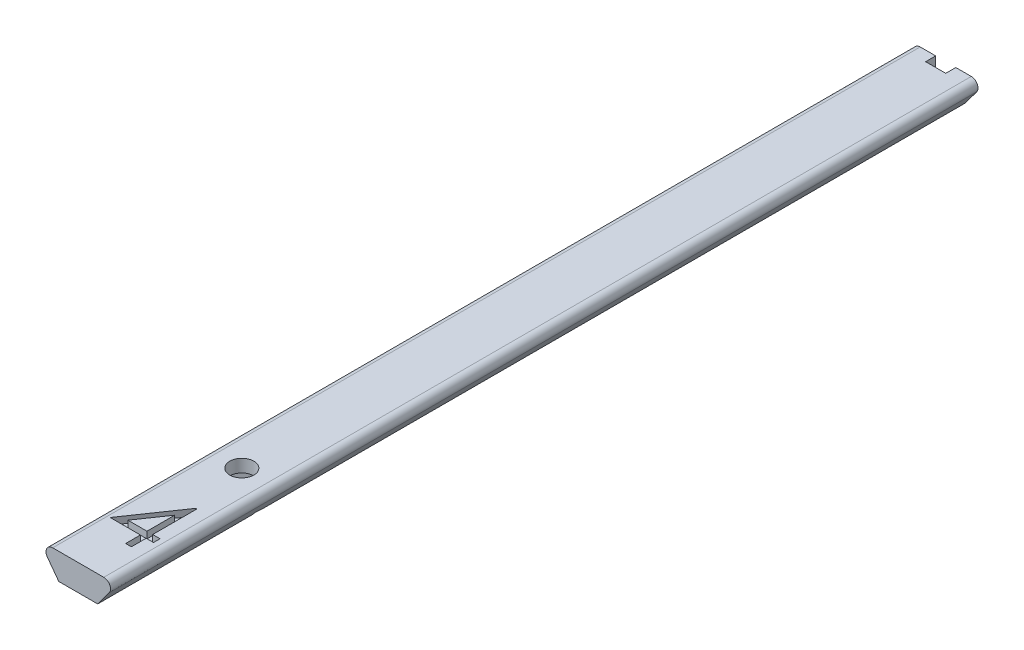
ISO-10303-21;
HEADER;
FILE_DESCRIPTION(('STEP AP214'),'2;1');
FILE_NAME('part.step','',(''),(''),'','','');
FILE_SCHEMA(('AUTOMOTIVE_DESIGN { 1 0 10303 214 1 1 1 1 }'));
ENDSEC;
DATA;
#1=APPLICATION_CONTEXT('core data for automotive mechanical design processes');
#2=APPLICATION_PROTOCOL_DEFINITION('international standard','automotive_design',2000,#1);
#3=PRODUCT_CONTEXT('',#1,'mechanical');
#4=PRODUCT('Part','Part','',(#3));
#5=PRODUCT_RELATED_PRODUCT_CATEGORY('part','',(#4));
#6=PRODUCT_DEFINITION_FORMATION('','',#4);
#7=PRODUCT_DEFINITION_CONTEXT('part definition',#1,'design');
#8=PRODUCT_DEFINITION('design','',#6,#7);
#9=PRODUCT_DEFINITION_SHAPE('','',#8);
#10=(LENGTH_UNIT() NAMED_UNIT(*) SI_UNIT(.MILLI.,.METRE.));
#11=(NAMED_UNIT(*) PLANE_ANGLE_UNIT() SI_UNIT($,.RADIAN.));
#12=(NAMED_UNIT(*) SI_UNIT($,.STERADIAN.) SOLID_ANGLE_UNIT());
#13=UNCERTAINTY_MEASURE_WITH_UNIT(LENGTH_MEASURE(1.E-05),#10,'distance_accuracy_value','');
#14=(GEOMETRIC_REPRESENTATION_CONTEXT(3) GLOBAL_UNCERTAINTY_ASSIGNED_CONTEXT((#13)) GLOBAL_UNIT_ASSIGNED_CONTEXT((#10,
#11,#12)) REPRESENTATION_CONTEXT('',''));
#15=CARTESIAN_POINT('',(0.,0.,0.));
#16=DIRECTION('',(0.,0.,1.));
#17=DIRECTION('',(1.,0.,0.));
#18=AXIS2_PLACEMENT_3D('',#15,#16,#17);
#19=CARTESIAN_POINT('',(-2.9,3.9,171.2));
#20=DIRECTION('',(0.,-1.,0.));
#21=DIRECTION('',(0.,0.,-1.));
#22=AXIS2_PLACEMENT_3D('',#19,#20,#21);
#23=PLANE('',#22);
#24=DIRECTION('',(1.,0.,0.));
#25=VECTOR('',#24,1.);
#26=CARTESIAN_POINT('',(-12.9151598258059,3.9,41.8));
#27=LINE('',#26,#25);
#28=CARTESIAN_POINT('',(4.4,3.9,41.8));
#29=VERTEX_POINT('',#28);
#30=CARTESIAN_POINT('',(6.71024585843868,3.9,41.8));
#31=VERTEX_POINT('',#30);
#32=EDGE_CURVE('E57',#29,#31,#27,.T.);
#33=ORIENTED_EDGE('',*,*,#32,.F.);
#34=DIRECTION('',(0.,0.,-1.));
#35=VECTOR('',#34,1.);
#36=CARTESIAN_POINT('',(4.4,3.9,43.3));
#37=LINE('',#36,#35);
#38=CARTESIAN_POINT('',(4.4,3.9,43.3));
#39=VERTEX_POINT('',#38);
#40=EDGE_CURVE('E261',#39,#29,#37,.T.);
#41=ORIENTED_EDGE('',*,*,#40,.F.);
#42=DIRECTION('',(1.,0.,0.));
#43=VECTOR('',#42,1.);
#44=CARTESIAN_POINT('',(1.4,3.9,43.3));
#45=LINE('',#44,#43);
#46=CARTESIAN_POINT('',(1.4,3.9,43.3));
#47=VERTEX_POINT('',#46);
#48=EDGE_CURVE('E264',#47,#39,#45,.T.);
#49=ORIENTED_EDGE('',*,*,#48,.F.);
#50=DIRECTION('',(0.,0.,1.));
#51=VECTOR('',#50,1.);
#52=CARTESIAN_POINT('',(1.4,3.9,43.3));
#53=LINE('',#52,#51);
#54=CARTESIAN_POINT('',(1.4,3.9,41.8));
#55=VERTEX_POINT('',#54);
#56=EDGE_CURVE('E251',#55,#47,#53,.T.);
#57=ORIENTED_EDGE('',*,*,#56,.F.);
#58=CARTESIAN_POINT('',(-0.91024585843868,3.9,41.8));
#59=VERTEX_POINT('',#58);
#60=EDGE_CURVE('E267',#59,#55,#27,.T.);
#61=ORIENTED_EDGE('',*,*,#60,.F.);
#62=DIRECTION('',(0.,0.,-1.));
#63=VECTOR('',#62,1.);
#64=CARTESIAN_POINT('',(-0.91024585843868,3.9,171.2));
#65=LINE('',#64,#63);
#66=CARTESIAN_POINT('',(-0.91024585843868,3.9,171.2));
#67=VERTEX_POINT('',#66);
#68=EDGE_CURVE('E459',#59,#67,#65,.F.);
#69=ORIENTED_EDGE('',*,*,#68,.T.);
#70=DIRECTION('',(-1.,0.,0.));
#71=VECTOR('',#70,1.);
#72=CARTESIAN_POINT('',(-2.9,3.9,171.2));
#73=LINE('',#72,#71);
#74=CARTESIAN_POINT('',(6.71024585843868,3.9,171.2));
#75=VERTEX_POINT('',#74);
#76=EDGE_CURVE('E442',#75,#67,#73,.T.);
#77=ORIENTED_EDGE('',*,*,#76,.F.);
#78=DIRECTION('',(0.,0.,-1.));
#79=VECTOR('',#78,1.);
#80=CARTESIAN_POINT('',(6.71024585843868,3.9,171.2));
#81=LINE('',#80,#79);
#82=EDGE_CURVE('E456',#75,#31,#81,.T.);
#83=ORIENTED_EDGE('',*,*,#82,.T.);
#84=EDGE_LOOP('',(#33,#41,#49,#57,#61,#69,#77,#83));
#85=FACE_BOUND('',#84,.T.);
#86=CARTESIAN_POINT('',(2.9,3.89999999999999,146.8));
#87=DIRECTION('',(0.,-1.,0.));
#88=DIRECTION('',(0.,0.,-1.));
#89=AXIS2_PLACEMENT_3D('',#86,#87,#88);
#90=CIRCLE('',#89,1.8);
#91=CARTESIAN_POINT('',(2.9,3.89999999999999,145.));
#92=VERTEX_POINT('',#91);
#93=EDGE_CURVE('E434',#92,#92,#90,.T.);
#94=ORIENTED_EDGE('',*,*,#93,.T.);
#95=EDGE_LOOP('',(#94));
#96=FACE_BOUND('',#95,.T.);
#97=DIRECTION('',(0.566105543193207,0.,-0.824332768950698));
#98=VECTOR('',#97,1.);
#99=CARTESIAN_POINT('',(-0.543899704592526,3.9,163.001923076923));
#100=LINE('',#99,#98);
#101=CARTESIAN_POINT('',(-0.543899704592526,3.9,163.001923076923));
#102=VERTEX_POINT('',#101);
#103=CARTESIAN_POINT('',(4.6555444059844,3.9,155.430769230769));
#104=VERTEX_POINT('',#103);
#105=EDGE_CURVE('E302',#102,#104,#100,.T.);
#106=ORIENTED_EDGE('',*,*,#105,.T.);
#107=DIRECTION('',(1.,0.,0.));
#108=VECTOR('',#107,1.);
#109=CARTESIAN_POINT('',(4.6555444059844,3.9,155.430769230769));
#110=LINE('',#109,#108);
#111=CARTESIAN_POINT('',(4.8291772184844,3.9,155.430769230769));
#112=VERTEX_POINT('',#111);
#113=EDGE_CURVE('E332',#104,#112,#110,.T.);
#114=ORIENTED_EDGE('',*,*,#113,.T.);
#115=DIRECTION('',(0.,0.,1.));
#116=VECTOR('',#115,1.);
#117=CARTESIAN_POINT('',(4.8291772184844,3.9,155.430769230769));
#118=LINE('',#117,#116);
#119=CARTESIAN_POINT('',(4.8291772184844,3.9,162.025));
#120=VERTEX_POINT('',#119);
#121=EDGE_CURVE('E335',#112,#120,#118,.T.);
#122=ORIENTED_EDGE('',*,*,#121,.T.);
#123=DIRECTION('',(1.,0.,0.));
#124=VECTOR('',#123,1.);
#125=CARTESIAN_POINT('',(4.8291772184844,3.9,162.025));
#126=LINE('',#125,#124);
#127=CARTESIAN_POINT('',(5.92821568002286,3.9,162.025));
#128=VERTEX_POINT('',#127);
#129=EDGE_CURVE('E338',#120,#128,#126,.T.);
#130=ORIENTED_EDGE('',*,*,#129,.T.);
#131=DIRECTION('',(0.,0.,1.));
#132=VECTOR('',#131,1.);
#133=CARTESIAN_POINT('',(5.92821568002286,3.9,162.025));
#134=LINE('',#133,#132);
#135=CARTESIAN_POINT('',(5.92821568002286,3.9,163.001923076923));
#136=VERTEX_POINT('',#135);
#137=EDGE_CURVE('E341',#128,#136,#134,.T.);
#138=ORIENTED_EDGE('',*,*,#137,.T.);
#139=DIRECTION('',(-1.,0.,0.));
#140=VECTOR('',#139,1.);
#141=CARTESIAN_POINT('',(5.92821568002286,3.9,163.001923076923));
#142=LINE('',#141,#140);
#143=CARTESIAN_POINT('',(4.8291772184844,3.9,163.001923076923));
#144=VERTEX_POINT('',#143);
#145=EDGE_CURVE('E344',#136,#144,#142,.T.);
#146=ORIENTED_EDGE('',*,*,#145,.T.);
#147=DIRECTION('',(0.,0.,1.));
#148=VECTOR('',#147,1.);
#149=CARTESIAN_POINT('',(4.8291772184844,3.9,163.001923076923));
#150=LINE('',#149,#148);
#151=CARTESIAN_POINT('',(4.8291772184844,3.9,165.2));
#152=VERTEX_POINT('',#151);
#153=EDGE_CURVE('E347',#144,#152,#150,.T.);
#154=ORIENTED_EDGE('',*,*,#153,.T.);
#155=DIRECTION('',(-1.,0.,0.));
#156=VECTOR('',#155,1.);
#157=CARTESIAN_POINT('',(4.8291772184844,3.9,165.2));
#158=LINE('',#157,#156);
#159=CARTESIAN_POINT('',(3.9743695261767,3.9,165.2));
#160=VERTEX_POINT('',#159);
#161=EDGE_CURVE('E350',#152,#160,#158,.T.);
#162=ORIENTED_EDGE('',*,*,#161,.T.);
#163=DIRECTION('',(0.,0.,-1.));
#164=VECTOR('',#163,1.);
#165=CARTESIAN_POINT('',(3.9743695261767,3.9,165.2));
#166=LINE('',#165,#164);
#167=CARTESIAN_POINT('',(3.9743695261767,3.9,163.001923076923));
#168=VERTEX_POINT('',#167);
#169=EDGE_CURVE('E353',#160,#168,#166,.T.);
#170=ORIENTED_EDGE('',*,*,#169,.T.);
#171=DIRECTION('',(-1.,0.,0.));
#172=VECTOR('',#171,1.);
#173=CARTESIAN_POINT('',(3.9743695261767,3.9,163.001923076923));
#174=LINE('',#173,#172);
#175=EDGE_CURVE('E311',#168,#102,#174,.T.);
#176=ORIENTED_EDGE('',*,*,#175,.T.);
#177=EDGE_LOOP('',(#106,#114,#122,#130,#138,#146,#154,#162,#170,#176));
#178=FACE_BOUND('',#177,.T.);
#179=ADVANCED_FACE('F35',(#85,#96,#178),#23,.F.);
#180=CARTESIAN_POINT('',(0.,0.,171.2));
#181=DIRECTION('',(0.,1.,0.));
#182=DIRECTION('',(0.,0.,1.));
#183=AXIS2_PLACEMENT_3D('',#180,#181,#182);
#184=PLANE('',#183);
#185=DIRECTION('',(0.,0.,-1.));
#186=VECTOR('',#185,1.);
#187=CARTESIAN_POINT('',(0.,0.,171.2));
#188=LINE('',#187,#186);
#189=CARTESIAN_POINT('',(0.,0.,145.476986060241));
#190=VERTEX_POINT('',#189);
#191=CARTESIAN_POINT('',(0.,0.,41.8));
#192=VERTEX_POINT('',#191);
#193=EDGE_CURVE('E449',#190,#192,#188,.T.);
#194=ORIENTED_EDGE('',*,*,#193,.T.);
#195=DIRECTION('',(1.,0.,0.));
#196=VECTOR('',#195,1.);
#197=CARTESIAN_POINT('',(0.,0.,41.8));
#198=LINE('',#197,#196);
#199=CARTESIAN_POINT('',(5.8,0.,41.8));
#200=VERTEX_POINT('',#199);
#201=EDGE_CURVE('E273',#192,#200,#198,.T.);
#202=ORIENTED_EDGE('',*,*,#201,.T.);
#203=DIRECTION('',(0.,0.,-1.));
#204=VECTOR('',#203,1.);
#205=CARTESIAN_POINT('',(5.8,0.,171.2));
#206=LINE('',#205,#204);
#207=CARTESIAN_POINT('',(5.8,0.,146.521938005987));
#208=VERTEX_POINT('',#207);
#209=EDGE_CURVE('E445',#208,#200,#206,.T.);
#210=ORIENTED_EDGE('',*,*,#209,.F.);
#211=DIRECTION('',(0.190019918599868,0.,0.981780235355805));
#212=VECTOR('',#211,1.);
#213=CARTESIAN_POINT('',(5.42900933418225,0.,144.605132094874));
#214=LINE('',#213,#212);
#215=CARTESIAN_POINT('',(5.42900933418225,0.,144.605132094874));
#216=VERTEX_POINT('',#215);
#217=EDGE_CURVE('E384',#216,#208,#214,.T.);
#218=ORIENTED_EDGE('',*,*,#217,.F.);
#219=DIRECTION('',(0.94525658405152,0.,0.326328040945384));
#220=VECTOR('',#219,1.);
#221=CARTESIAN_POINT('',(2.26369330330089,0.,143.512379717627));
#222=LINE('',#221,#220);
#223=CARTESIAN_POINT('',(2.26369330330089,0.,143.512379717627));
#224=VERTEX_POINT('',#223);
#225=EDGE_CURVE('E408',#224,#216,#222,.T.);
#226=ORIENTED_EDGE('',*,*,#225,.F.);
#227=DIRECTION('',(0.755236665451656,0.,-0.655452194410442));
#228=VECTOR('',#227,1.);
#229=CARTESIAN_POINT('',(-0.265316030881379,0.,145.707247622753));
#230=LINE('',#229,#228);
#231=EDGE_CURVE('E406',#190,#224,#230,.T.);
#232=ORIENTED_EDGE('',*,*,#231,.F.);
#233=EDGE_LOOP('',(#194,#202,#210,#218,#226,#232));
#234=FACE_BOUND('',#233,.T.);
#235=ADVANCED_FACE('F497',(#234),#184,.F.);
#236=CARTESIAN_POINT('',(2.9,200.,146.8));
#237=DIRECTION('',(0.,-1.,0.));
#238=DIRECTION('',(0.,0.,-1.));
#239=AXIS2_PLACEMENT_3D('',#236,#237,#238);
#240=CYLINDRICAL_SURFACE('',#239,1.8);
#241=ORIENTED_EDGE('',*,*,#93,.F.);
#242=EDGE_LOOP('',(#241));
#243=FACE_BOUND('',#242,.T.);
#244=CARTESIAN_POINT('',(2.9,2.,146.8));
#245=DIRECTION('',(0.,-1.,0.));
#246=DIRECTION('',(0.,0.,-1.));
#247=AXIS2_PLACEMENT_3D('',#244,#245,#246);
#248=CIRCLE('',#247,1.8);
#249=CARTESIAN_POINT('',(2.9,2.,145.));
#250=VERTEX_POINT('',#249);
#251=EDGE_CURVE('E415',#250,#250,#248,.F.);
#252=ORIENTED_EDGE('',*,*,#251,.F.);
#253=EDGE_LOOP('',(#252));
#254=FACE_BOUND('',#253,.T.);
#255=ADVANCED_FACE('F502',(#243,#254),#240,.F.);
#256=CARTESIAN_POINT('',(0.,0.,171.2));
#257=DIRECTION('',(0.802462340946133,0.596702766344561,0.));
#258=DIRECTION('',(-0.596702766344561,0.802462340946133,0.));
#259=AXIS2_PLACEMENT_3D('',#256,#257,#258);
#260=PLANE('',#259);
#261=DIRECTION('',(0.,0.,-1.));
#262=VECTOR('',#261,1.);
#263=CARTESIAN_POINT('',(-1.71270819938481,2.30329723365544,171.2));
#264=LINE('',#263,#262);
#265=CARTESIAN_POINT('',(-1.71270819938481,2.30329723365544,171.2));
#266=VERTEX_POINT('',#265);
#267=CARTESIAN_POINT('',(-1.71270819938481,2.30329723365544,41.8));
#268=VERTEX_POINT('',#267);
#269=EDGE_CURVE('E453',#266,#268,#264,.T.);
#270=ORIENTED_EDGE('',*,*,#269,.T.);
#271=DIRECTION('',(0.596702766344561,-0.802462340946133,0.));
#272=VECTOR('',#271,1.);
#273=CARTESIAN_POINT('',(0.,0.,41.8));
#274=LINE('',#273,#272);
#275=EDGE_CURVE('E276',#268,#192,#274,.T.);
#276=ORIENTED_EDGE('',*,*,#275,.T.);
#277=ORIENTED_EDGE('',*,*,#193,.F.);
#278=DIRECTION('',(-0.529867163168724,0.71257997805449,0.459859287468885));
#279=VECTOR('',#278,1.);
#280=CARTESIAN_POINT('',(-6.2677811143264,8.42908494685274,150.916646332843));
#281=LINE('',#280,#279);
#282=CARTESIAN_POINT('',(-0.265316030881378,0.356804317392195,145.707247622753));
#283=VERTEX_POINT('',#282);
#284=EDGE_CURVE('E431',#190,#283,#281,.T.);
#285=ORIENTED_EDGE('',*,*,#284,.T.);
#286=DIRECTION('',(0.184103736790054,-0.247587783959038,0.951212964237868));
#287=VECTOR('',#286,1.);
#288=CARTESIAN_POINT('',(4.22427867934336,-5.68092649980659,168.903738726079));
#289=LINE('',#288,#287);
#290=CARTESIAN_POINT('',(0.,0.,147.078061994013));
#291=VERTEX_POINT('',#290);
#292=EDGE_CURVE('E428',#283,#291,#289,.T.);
#293=ORIENTED_EDGE('',*,*,#292,.T.);
#294=CARTESIAN_POINT('',(0.,0.,171.2));
#295=VERTEX_POINT('',#294);
#296=EDGE_CURVE('E450',#295,#291,#188,.T.);
#297=ORIENTED_EDGE('',*,*,#296,.F.);
#298=DIRECTION('',(0.596702766344561,-0.802462340946133,0.));
#299=VECTOR('',#298,1.);
#300=CARTESIAN_POINT('',(0.,0.,171.2));
#301=LINE('',#300,#299);
#302=EDGE_CURVE('E435',#266,#295,#301,.T.);
#303=ORIENTED_EDGE('',*,*,#302,.F.);
#304=EDGE_LOOP('',(#270,#276,#277,#285,#293,#297,#303));
#305=FACE_BOUND('',#304,.T.);
#306=ADVANCED_FACE('F619',(#305),#260,.F.);
#307=DIRECTION('',(-0.94525658405153,0.,-0.326328040945354));
#308=VECTOR('',#307,1.);
#309=CARTESIAN_POINT('',(3.53630669669914,0.,150.087620282373));
#310=LINE('',#309,#308);
#311=CARTESIAN_POINT('',(3.53630669669914,0.,150.087620282373));
#312=VERTEX_POINT('',#311);
#313=CARTESIAN_POINT('',(0.370990665817778,0.,148.994867905126));
#314=VERTEX_POINT('',#313);
#315=EDGE_CURVE('E401',#312,#314,#310,.T.);
#316=ORIENTED_EDGE('',*,*,#315,.F.);
#317=DIRECTION('',(-0.755236665451676,0.,0.655452194410419));
#318=VECTOR('',#317,1.);
#319=CARTESIAN_POINT('',(6.0653160308814,0.,147.892752377247));
#320=LINE('',#319,#318);
#321=CARTESIAN_POINT('',(5.8,0.,148.123013939759));
#322=VERTEX_POINT('',#321);
#323=EDGE_CURVE('E379',#322,#312,#320,.T.);
#324=ORIENTED_EDGE('',*,*,#323,.F.);
#325=CARTESIAN_POINT('',(5.8,0.,171.2));
#326=VERTEX_POINT('',#325);
#327=EDGE_CURVE('E446',#326,#322,#206,.T.);
#328=ORIENTED_EDGE('',*,*,#327,.F.);
#329=DIRECTION('',(1.,0.,0.));
#330=VECTOR('',#329,1.);
#331=CARTESIAN_POINT('',(0.,0.,171.2));
#332=LINE('',#331,#330);
#333=EDGE_CURVE('E437',#295,#326,#332,.T.);
#334=ORIENTED_EDGE('',*,*,#333,.F.);
#335=ORIENTED_EDGE('',*,*,#296,.T.);
#336=DIRECTION('',(-0.190019918599871,0.,-0.981780235355804));
#337=VECTOR('',#336,1.);
#338=CARTESIAN_POINT('',(0.370990665817778,0.,148.994867905126));
#339=LINE('',#338,#337);
#340=EDGE_CURVE('E404',#314,#291,#339,.T.);
#341=ORIENTED_EDGE('',*,*,#340,.F.);
#342=EDGE_LOOP('',(#316,#324,#328,#334,#335,#341));
#343=FACE_BOUND('',#342,.T.);
#344=ADVANCED_FACE('F505',(#343),#184,.F.);
#345=CARTESIAN_POINT('',(5.8,0.,171.2));
#346=DIRECTION('',(-0.802462340946134,0.596702766344561,0.));
#347=DIRECTION('',(-0.596702766344561,-0.802462340946134,0.));
#348=AXIS2_PLACEMENT_3D('',#345,#346,#347);
#349=PLANE('',#348);
#350=ORIENTED_EDGE('',*,*,#209,.T.);
#351=DIRECTION('',(0.596702766344561,0.802462340946134,0.));
#352=VECTOR('',#351,1.);
#353=CARTESIAN_POINT('',(5.8,0.,41.8));
#354=LINE('',#353,#352);
#355=CARTESIAN_POINT('',(7.51270819938481,2.30329723365544,41.8));
#356=VERTEX_POINT('',#355);
#357=EDGE_CURVE('E270',#200,#356,#354,.T.);
#358=ORIENTED_EDGE('',*,*,#357,.T.);
#359=DIRECTION('',(0.,0.,-1.));
#360=VECTOR('',#359,1.);
#361=CARTESIAN_POINT('',(7.51270819938481,2.30329723365544,171.2));
#362=LINE('',#361,#360);
#363=CARTESIAN_POINT('',(7.51270819938481,2.30329723365544,171.2));
#364=VERTEX_POINT('',#363);
#365=EDGE_CURVE('E465',#356,#364,#362,.F.);
#366=ORIENTED_EDGE('',*,*,#365,.T.);
#367=DIRECTION('',(0.596702766344561,0.802462340946133,0.));
#368=VECTOR('',#367,1.);
#369=CARTESIAN_POINT('',(5.8,0.,171.2));
#370=LINE('',#369,#368);
#371=EDGE_CURVE('E439',#326,#364,#370,.T.);
#372=ORIENTED_EDGE('',*,*,#371,.F.);
#373=ORIENTED_EDGE('',*,*,#327,.T.);
#374=DIRECTION('',(0.529867163168731,0.7125799780545,-0.459859287468863));
#375=VECTOR('',#374,1.);
#376=CARTESIAN_POINT('',(0.176961512259686,-7.56201727661629,153.003117203601));
#377=LINE('',#376,#375);
#378=CARTESIAN_POINT('',(6.0653160308814,0.35680431739223,147.892752377247));
#379=VERTEX_POINT('',#378);
#380=EDGE_CURVE('E474',#322,#379,#377,.T.);
#381=ORIENTED_EDGE('',*,*,#380,.T.);
#382=DIRECTION('',(-0.184103736790051,-0.247587783959034,-0.95121296423787));
#383=VECTOR('',#382,1.);
#384=CARTESIAN_POINT('',(10.1216681471841,5.81189854276489,168.85079911663));
#385=LINE('',#384,#383);
#386=EDGE_CURVE('E467',#379,#208,#385,.T.);
#387=ORIENTED_EDGE('',*,*,#386,.T.);
#388=EDGE_LOOP('',(#350,#358,#366,#372,#373,#381,#387));
#389=FACE_BOUND('',#388,.T.);
#390=ADVANCED_FACE('F624',(#389),#349,.F.);
#391=CARTESIAN_POINT('',(0.,0.,171.2));
#392=DIRECTION('',(0.,0.,-1.));
#393=DIRECTION('',(-1.,0.,0.));
#394=AXIS2_PLACEMENT_3D('',#391,#392,#393);
#395=PLANE('',#394);
#396=ORIENTED_EDGE('',*,*,#76,.T.);
#397=CARTESIAN_POINT('',(-0.91024585843868,2.9,171.2));
#398=DIRECTION('',(0.,0.,-1.));
#399=DIRECTION('',(-1.,0.,0.));
#400=AXIS2_PLACEMENT_3D('',#397,#398,#399);
#401=CIRCLE('',#400,1.);
#402=EDGE_CURVE('E463',#67,#266,#401,.F.);
#403=ORIENTED_EDGE('',*,*,#402,.T.);
#404=ORIENTED_EDGE('',*,*,#302,.T.);
#405=ORIENTED_EDGE('',*,*,#333,.T.);
#406=ORIENTED_EDGE('',*,*,#371,.T.);
#407=CARTESIAN_POINT('',(6.71024585843868,2.9,171.2));
#408=DIRECTION('',(0.,0.,-1.));
#409=DIRECTION('',(-1.,0.,0.));
#410=AXIS2_PLACEMENT_3D('',#407,#408,#409);
#411=CIRCLE('',#410,1.);
#412=EDGE_CURVE('E461',#364,#75,#411,.F.);
#413=ORIENTED_EDGE('',*,*,#412,.T.);
#414=EDGE_LOOP('',(#396,#403,#404,#405,#406,#413));
#415=FACE_BOUND('',#414,.T.);
#416=ADVANCED_FACE('F621',(#415),#395,.F.);
#417=CARTESIAN_POINT('',(-0.91024585843868,2.9,171.2));
#418=DIRECTION('',(0.,0.,-1.));
#419=DIRECTION('',(-1.,0.,0.));
#420=AXIS2_PLACEMENT_3D('',#417,#418,#419);
#421=CYLINDRICAL_SURFACE('',#420,1.);
#422=CARTESIAN_POINT('',(-0.91024585843868,2.9,41.8));
#423=DIRECTION('',(0.,0.,1.));
#424=DIRECTION('',(1.,0.,0.));
#425=AXIS2_PLACEMENT_3D('',#422,#423,#424);
#426=CIRCLE('',#425,1.);
#427=EDGE_CURVE('E279',#268,#59,#426,.F.);
#428=ORIENTED_EDGE('',*,*,#427,.F.);
#429=ORIENTED_EDGE('',*,*,#269,.F.);
#430=ORIENTED_EDGE('',*,*,#402,.F.);
#431=ORIENTED_EDGE('',*,*,#68,.F.);
#432=EDGE_LOOP('',(#428,#429,#430,#431));
#433=FACE_BOUND('',#432,.T.);
#434=ADVANCED_FACE('F623',(#433),#421,.T.);
#435=CARTESIAN_POINT('',(6.71024585843868,2.9,171.2));
#436=DIRECTION('',(0.,0.,-1.));
#437=DIRECTION('',(-1.,0.,0.));
#438=AXIS2_PLACEMENT_3D('',#435,#436,#437);
#439=CYLINDRICAL_SURFACE('',#438,1.);
#440=CARTESIAN_POINT('',(6.71024585843868,2.9,41.8));
#441=DIRECTION('',(0.,0.,1.));
#442=DIRECTION('',(1.,0.,0.));
#443=AXIS2_PLACEMENT_3D('',#440,#441,#442);
#444=CIRCLE('',#443,1.);
#445=EDGE_CURVE('E477',#31,#356,#444,.F.);
#446=ORIENTED_EDGE('',*,*,#445,.F.);
#447=ORIENTED_EDGE('',*,*,#82,.F.);
#448=ORIENTED_EDGE('',*,*,#412,.F.);
#449=ORIENTED_EDGE('',*,*,#365,.F.);
#450=EDGE_LOOP('',(#446,#447,#448,#449));
#451=FACE_BOUND('',#450,.T.);
#452=ADVANCED_FACE('F37',(#451),#439,.T.);
#453=CARTESIAN_POINT('',(-0.265316030881379,2.,145.707247622753));
#454=DIRECTION('',(-0.655452194410442,0.,-0.755236665451656));
#455=DIRECTION('',(-0.755236665451656,0.,0.655452194410442));
#456=AXIS2_PLACEMENT_3D('',#453,#454,#455);
#457=PLANE('',#456);
#458=ORIENTED_EDGE('',*,*,#231,.T.);
#459=DIRECTION('',(0.,-1.,0.));
#460=VECTOR('',#459,1.);
#461=CARTESIAN_POINT('',(2.26369330330089,2.,143.512379717627));
#462=LINE('',#461,#460);
#463=CARTESIAN_POINT('',(2.26369330330089,2.,143.512379717627));
#464=VERTEX_POINT('',#463);
#465=EDGE_CURVE('E418',#464,#224,#462,.T.);
#466=ORIENTED_EDGE('',*,*,#465,.F.);
#467=DIRECTION('',(0.755236665451656,0.,-0.655452194410442));
#468=VECTOR('',#467,1.);
#469=CARTESIAN_POINT('',(-0.265316030881379,2.,145.707247622753));
#470=LINE('',#469,#468);
#471=CARTESIAN_POINT('',(-0.265316030881379,2.,145.707247622753));
#472=VERTEX_POINT('',#471);
#473=EDGE_CURVE('E390',#472,#464,#470,.T.);
#474=ORIENTED_EDGE('',*,*,#473,.F.);
#475=DIRECTION('',(0.,-1.,0.));
#476=VECTOR('',#475,1.);
#477=CARTESIAN_POINT('',(-0.265316030881379,2.,145.707247622753));
#478=LINE('',#477,#476);
#479=EDGE_CURVE('E421',#472,#283,#478,.T.);
#480=ORIENTED_EDGE('',*,*,#479,.T.);
#481=ORIENTED_EDGE('',*,*,#284,.F.);
#482=EDGE_LOOP('',(#458,#466,#474,#480,#481));
#483=FACE_BOUND('',#482,.T.);
#484=ADVANCED_FACE('F604',(#483),#457,.F.);
#485=CARTESIAN_POINT('',(0.370990665817778,2.,148.994867905126));
#486=DIRECTION('',(-0.981780235355804,0.,0.190019918599871));
#487=DIRECTION('',(0.190019918599871,0.,0.981780235355804));
#488=AXIS2_PLACEMENT_3D('',#485,#486,#487);
#489=PLANE('',#488);
#490=ORIENTED_EDGE('',*,*,#479,.F.);
#491=DIRECTION('',(-0.190019918599871,0.,-0.981780235355804));
#492=VECTOR('',#491,1.);
#493=CARTESIAN_POINT('',(0.370990665817778,2.,148.994867905126));
#494=LINE('',#493,#492);
#495=CARTESIAN_POINT('',(0.370990665817778,2.,148.994867905126));
#496=VERTEX_POINT('',#495);
#497=EDGE_CURVE('E387',#496,#472,#494,.T.);
#498=ORIENTED_EDGE('',*,*,#497,.F.);
#499=DIRECTION('',(0.,-1.,0.));
#500=VECTOR('',#499,1.);
#501=CARTESIAN_POINT('',(0.370990665817778,2.,148.994867905126));
#502=LINE('',#501,#500);
#503=EDGE_CURVE('E424',#496,#314,#502,.T.);
#504=ORIENTED_EDGE('',*,*,#503,.T.);
#505=ORIENTED_EDGE('',*,*,#340,.T.);
#506=ORIENTED_EDGE('',*,*,#292,.F.);
#507=EDGE_LOOP('',(#490,#498,#504,#505,#506));
#508=FACE_BOUND('',#507,.T.);
#509=ADVANCED_FACE('F607',(#508),#489,.F.);
#510=CARTESIAN_POINT('',(6.0653160308814,2.,147.892752377247));
#511=DIRECTION('',(0.655452194410419,0.,0.755236665451676));
#512=DIRECTION('',(0.755236665451676,0.,-0.655452194410419));
#513=AXIS2_PLACEMENT_3D('',#510,#511,#512);
#514=PLANE('',#513);
#515=ORIENTED_EDGE('',*,*,#323,.T.);
#516=DIRECTION('',(0.,-1.,0.));
#517=VECTOR('',#516,1.);
#518=CARTESIAN_POINT('',(3.53630669669914,2.,150.087620282373));
#519=LINE('',#518,#517);
#520=CARTESIAN_POINT('',(3.53630669669914,2.,150.087620282373));
#521=VERTEX_POINT('',#520);
#522=EDGE_CURVE('E399',#521,#312,#519,.T.);
#523=ORIENTED_EDGE('',*,*,#522,.F.);
#524=DIRECTION('',(-0.755236665451676,0.,0.655452194410419));
#525=VECTOR('',#524,1.);
#526=CARTESIAN_POINT('',(6.0653160308814,2.,147.892752377247));
#527=LINE('',#526,#525);
#528=CARTESIAN_POINT('',(6.0653160308814,2.,147.892752377247));
#529=VERTEX_POINT('',#528);
#530=EDGE_CURVE('E380',#529,#521,#527,.T.);
#531=ORIENTED_EDGE('',*,*,#530,.F.);
#532=DIRECTION('',(0.,-1.,0.));
#533=VECTOR('',#532,1.);
#534=CARTESIAN_POINT('',(6.0653160308814,2.,147.892752377247));
#535=LINE('',#534,#533);
#536=EDGE_CURVE('E412',#529,#379,#535,.T.);
#537=ORIENTED_EDGE('',*,*,#536,.T.);
#538=ORIENTED_EDGE('',*,*,#380,.F.);
#539=EDGE_LOOP('',(#515,#523,#531,#537,#538));
#540=FACE_BOUND('',#539,.T.);
#541=ADVANCED_FACE('F599',(#540),#514,.F.);
#542=CARTESIAN_POINT('',(5.42900933418225,2.,144.605132094874));
#543=DIRECTION('',(0.981780235355805,0.,-0.190019918599868));
#544=DIRECTION('',(-0.190019918599868,0.,-0.981780235355805));
#545=AXIS2_PLACEMENT_3D('',#542,#543,#544);
#546=PLANE('',#545);
#547=ORIENTED_EDGE('',*,*,#536,.F.);
#548=DIRECTION('',(0.190019918599868,0.,0.981780235355805));
#549=VECTOR('',#548,1.);
#550=CARTESIAN_POINT('',(5.42900933418225,2.,144.605132094874));
#551=LINE('',#550,#549);
#552=CARTESIAN_POINT('',(5.42900933418225,2.,144.605132094874));
#553=VERTEX_POINT('',#552);
#554=EDGE_CURVE('E396',#553,#529,#551,.T.);
#555=ORIENTED_EDGE('',*,*,#554,.F.);
#556=DIRECTION('',(0.,-1.,0.));
#557=VECTOR('',#556,1.);
#558=CARTESIAN_POINT('',(5.42900933418225,2.,144.605132094874));
#559=LINE('',#558,#557);
#560=EDGE_CURVE('E416',#553,#216,#559,.T.);
#561=ORIENTED_EDGE('',*,*,#560,.T.);
#562=ORIENTED_EDGE('',*,*,#217,.T.);
#563=ORIENTED_EDGE('',*,*,#386,.F.);
#564=EDGE_LOOP('',(#547,#555,#561,#562,#563));
#565=FACE_BOUND('',#564,.T.);
#566=ADVANCED_FACE('F595',(#565),#546,.F.);
#567=CARTESIAN_POINT('',(0.,2.,0.));
#568=DIRECTION('',(0.,-1.,0.));
#569=DIRECTION('',(0.,0.,-1.));
#570=AXIS2_PLACEMENT_3D('',#567,#568,#569);
#571=PLANE('',#570);
#572=ORIENTED_EDGE('',*,*,#530,.T.);
#573=DIRECTION('',(-0.94525658405153,0.,-0.326328040945354));
#574=VECTOR('',#573,1.);
#575=CARTESIAN_POINT('',(3.53630669669914,2.,150.087620282373));
#576=LINE('',#575,#574);
#577=EDGE_CURVE('E383',#521,#496,#576,.T.);
#578=ORIENTED_EDGE('',*,*,#577,.T.);
#579=ORIENTED_EDGE('',*,*,#497,.T.);
#580=ORIENTED_EDGE('',*,*,#473,.T.);
#581=DIRECTION('',(0.94525658405152,0.,0.326328040945384));
#582=VECTOR('',#581,1.);
#583=CARTESIAN_POINT('',(2.26369330330089,2.,143.512379717627));
#584=LINE('',#583,#582);
#585=EDGE_CURVE('E393',#464,#553,#584,.T.);
#586=ORIENTED_EDGE('',*,*,#585,.T.);
#587=ORIENTED_EDGE('',*,*,#554,.T.);
#588=EDGE_LOOP('',(#572,#578,#579,#580,#586,#587));
#589=FACE_BOUND('',#588,.T.);
#590=ORIENTED_EDGE('',*,*,#251,.T.);
#591=EDGE_LOOP('',(#590));
#592=FACE_BOUND('',#591,.T.);
#593=ADVANCED_FACE('F591',(#589,#592),#571,.T.);
#594=CARTESIAN_POINT('',(2.26369330330089,2.,143.512379717627));
#595=DIRECTION('',(0.326328040945384,0.,-0.94525658405152));
#596=DIRECTION('',(-0.94525658405152,0.,-0.326328040945384));
#597=AXIS2_PLACEMENT_3D('',#594,#595,#596);
#598=PLANE('',#597);
#599=ORIENTED_EDGE('',*,*,#225,.T.);
#600=ORIENTED_EDGE('',*,*,#560,.F.);
#601=ORIENTED_EDGE('',*,*,#585,.F.);
#602=ORIENTED_EDGE('',*,*,#465,.T.);
#603=EDGE_LOOP('',(#599,#600,#601,#602));
#604=FACE_BOUND('',#603,.T.);
#605=ADVANCED_FACE('F594',(#604),#598,.F.);
#606=CARTESIAN_POINT('',(3.53630669669914,2.,150.087620282373));
#607=DIRECTION('',(-0.326328040945354,0.,0.94525658405153));
#608=DIRECTION('',(0.94525658405153,0.,0.326328040945354));
#609=AXIS2_PLACEMENT_3D('',#606,#607,#608);
#610=PLANE('',#609);
#611=ORIENTED_EDGE('',*,*,#315,.T.);
#612=ORIENTED_EDGE('',*,*,#503,.F.);
#613=ORIENTED_EDGE('',*,*,#577,.F.);
#614=ORIENTED_EDGE('',*,*,#522,.T.);
#615=EDGE_LOOP('',(#611,#612,#613,#614));
#616=FACE_BOUND('',#615,.T.);
#617=ADVANCED_FACE('F590',(#616),#610,.F.);
#618=CARTESIAN_POINT('',(-0.543899704592526,2.9,163.001923076923));
#619=DIRECTION('',(0.824332768950698,0.,0.566105543193207));
#620=DIRECTION('',(0.566105543193207,0.,-0.824332768950698));
#621=AXIS2_PLACEMENT_3D('',#618,#619,#620);
#622=PLANE('',#621);
#623=ORIENTED_EDGE('',*,*,#105,.F.);
#624=DIRECTION('',(0.,1.,0.));
#625=VECTOR('',#624,1.);
#626=CARTESIAN_POINT('',(-0.543899704592526,2.9,163.001923076923));
#627=LINE('',#626,#625);
#628=CARTESIAN_POINT('',(-0.543899704592526,2.9,163.001923076923));
#629=VERTEX_POINT('',#628);
#630=EDGE_CURVE('E329',#629,#102,#627,.T.);
#631=ORIENTED_EDGE('',*,*,#630,.F.);
#632=DIRECTION('',(0.566105543193207,0.,-0.824332768950698));
#633=VECTOR('',#632,1.);
#634=CARTESIAN_POINT('',(-0.543899704592526,2.9,163.001923076923));
#635=LINE('',#634,#633);
#636=CARTESIAN_POINT('',(4.6555444059844,2.9,155.430769230769));
#637=VERTEX_POINT('',#636);
#638=EDGE_CURVE('E307',#629,#637,#635,.T.);
#639=ORIENTED_EDGE('',*,*,#638,.T.);
#640=DIRECTION('',(0.,1.,0.));
#641=VECTOR('',#640,1.);
#642=CARTESIAN_POINT('',(4.6555444059844,2.9,155.430769230769));
#643=LINE('',#642,#641);
#644=EDGE_CURVE('E376',#637,#104,#643,.T.);
#645=ORIENTED_EDGE('',*,*,#644,.T.);
#646=EDGE_LOOP('',(#623,#631,#639,#645));
#647=FACE_BOUND('',#646,.T.);
#648=ADVANCED_FACE('F538',(#647),#622,.T.);
#649=CARTESIAN_POINT('',(4.6555444059844,2.9,155.430769230769));
#650=DIRECTION('',(0.,0.,1.));
#651=DIRECTION('',(1.,0.,0.));
#652=AXIS2_PLACEMENT_3D('',#649,#650,#651);
#653=PLANE('',#652);
#654=ORIENTED_EDGE('',*,*,#113,.F.);
#655=ORIENTED_EDGE('',*,*,#644,.F.);
#656=DIRECTION('',(1.,0.,0.));
#657=VECTOR('',#656,1.);
#658=CARTESIAN_POINT('',(4.6555444059844,2.9,155.430769230769));
#659=LINE('',#658,#657);
#660=CARTESIAN_POINT('',(4.8291772184844,2.9,155.430769230769));
#661=VERTEX_POINT('',#660);
#662=EDGE_CURVE('E310',#637,#661,#659,.T.);
#663=ORIENTED_EDGE('',*,*,#662,.T.);
#664=DIRECTION('',(0.,1.,0.));
#665=VECTOR('',#664,1.);
#666=CARTESIAN_POINT('',(4.8291772184844,2.9,155.430769230769));
#667=LINE('',#666,#665);
#668=EDGE_CURVE('E374',#661,#112,#667,.T.);
#669=ORIENTED_EDGE('',*,*,#668,.T.);
#670=EDGE_LOOP('',(#654,#655,#663,#669));
#671=FACE_BOUND('',#670,.T.);
#672=ADVANCED_FACE('F540',(#671),#653,.T.);
#673=CARTESIAN_POINT('',(4.8291772184844,2.9,155.430769230769));
#674=DIRECTION('',(-1.,0.,0.));
#675=DIRECTION('',(0.,0.,1.));
#676=AXIS2_PLACEMENT_3D('',#673,#674,#675);
#677=PLANE('',#676);
#678=ORIENTED_EDGE('',*,*,#121,.F.);
#679=ORIENTED_EDGE('',*,*,#668,.F.);
#680=DIRECTION('',(0.,0.,1.));
#681=VECTOR('',#680,1.);
#682=CARTESIAN_POINT('',(4.8291772184844,2.9,155.430769230769));
#683=LINE('',#682,#681);
#684=CARTESIAN_POINT('',(4.8291772184844,2.9,162.025));
#685=VERTEX_POINT('',#684);
#686=EDGE_CURVE('E313',#661,#685,#683,.T.);
#687=ORIENTED_EDGE('',*,*,#686,.T.);
#688=DIRECTION('',(0.,1.,0.));
#689=VECTOR('',#688,1.);
#690=CARTESIAN_POINT('',(4.8291772184844,2.9,162.025));
#691=LINE('',#690,#689);
#692=EDGE_CURVE('E372',#685,#120,#691,.T.);
#693=ORIENTED_EDGE('',*,*,#692,.T.);
#694=EDGE_LOOP('',(#678,#679,#687,#693));
#695=FACE_BOUND('',#694,.T.);
#696=ADVANCED_FACE('F577',(#695),#677,.T.);
#697=CARTESIAN_POINT('',(4.8291772184844,2.9,162.025));
#698=DIRECTION('',(0.,0.,1.));
#699=DIRECTION('',(1.,0.,0.));
#700=AXIS2_PLACEMENT_3D('',#697,#698,#699);
#701=PLANE('',#700);
#702=ORIENTED_EDGE('',*,*,#129,.F.);
#703=ORIENTED_EDGE('',*,*,#692,.F.);
#704=DIRECTION('',(1.,0.,0.));
#705=VECTOR('',#704,1.);
#706=CARTESIAN_POINT('',(4.8291772184844,2.9,162.025));
#707=LINE('',#706,#705);
#708=CARTESIAN_POINT('',(5.92821568002286,2.9,162.025));
#709=VERTEX_POINT('',#708);
#710=EDGE_CURVE('E315',#685,#709,#707,.T.);
#711=ORIENTED_EDGE('',*,*,#710,.T.);
#712=DIRECTION('',(0.,1.,0.));
#713=VECTOR('',#712,1.);
#714=CARTESIAN_POINT('',(5.92821568002286,2.9,162.025));
#715=LINE('',#714,#713);
#716=EDGE_CURVE('E370',#709,#128,#715,.T.);
#717=ORIENTED_EDGE('',*,*,#716,.T.);
#718=EDGE_LOOP('',(#702,#703,#711,#717));
#719=FACE_BOUND('',#718,.T.);
#720=ADVANCED_FACE('F574',(#719),#701,.T.);
#721=CARTESIAN_POINT('',(5.92821568002286,2.9,162.025));
#722=DIRECTION('',(-1.,0.,0.));
#723=DIRECTION('',(0.,0.,1.));
#724=AXIS2_PLACEMENT_3D('',#721,#722,#723);
#725=PLANE('',#724);
#726=ORIENTED_EDGE('',*,*,#137,.F.);
#727=ORIENTED_EDGE('',*,*,#716,.F.);
#728=DIRECTION('',(0.,0.,1.));
#729=VECTOR('',#728,1.);
#730=CARTESIAN_POINT('',(5.92821568002286,2.9,162.025));
#731=LINE('',#730,#729);
#732=CARTESIAN_POINT('',(5.92821568002286,2.9,163.001923076923));
#733=VERTEX_POINT('',#732);
#734=EDGE_CURVE('E317',#709,#733,#731,.T.);
#735=ORIENTED_EDGE('',*,*,#734,.T.);
#736=DIRECTION('',(0.,1.,0.));
#737=VECTOR('',#736,1.);
#738=CARTESIAN_POINT('',(5.92821568002286,2.9,163.001923076923));
#739=LINE('',#738,#737);
#740=EDGE_CURVE('E368',#733,#136,#739,.T.);
#741=ORIENTED_EDGE('',*,*,#740,.T.);
#742=EDGE_LOOP('',(#726,#727,#735,#741));
#743=FACE_BOUND('',#742,.T.);
#744=ADVANCED_FACE('F571',(#743),#725,.T.);
#745=CARTESIAN_POINT('',(5.92821568002286,2.9,163.001923076923));
#746=DIRECTION('',(0.,0.,-1.));
#747=DIRECTION('',(-1.,0.,0.));
#748=AXIS2_PLACEMENT_3D('',#745,#746,#747);
#749=PLANE('',#748);
#750=ORIENTED_EDGE('',*,*,#145,.F.);
#751=ORIENTED_EDGE('',*,*,#740,.F.);
#752=DIRECTION('',(-1.,0.,0.));
#753=VECTOR('',#752,1.);
#754=CARTESIAN_POINT('',(5.92821568002286,2.9,163.001923076923));
#755=LINE('',#754,#753);
#756=CARTESIAN_POINT('',(4.8291772184844,2.9,163.001923076923));
#757=VERTEX_POINT('',#756);
#758=EDGE_CURVE('E319',#733,#757,#755,.T.);
#759=ORIENTED_EDGE('',*,*,#758,.T.);
#760=DIRECTION('',(0.,1.,0.));
#761=VECTOR('',#760,1.);
#762=CARTESIAN_POINT('',(4.8291772184844,2.9,163.001923076923));
#763=LINE('',#762,#761);
#764=EDGE_CURVE('E366',#757,#144,#763,.T.);
#765=ORIENTED_EDGE('',*,*,#764,.T.);
#766=EDGE_LOOP('',(#750,#751,#759,#765));
#767=FACE_BOUND('',#766,.T.);
#768=ADVANCED_FACE('F564',(#767),#749,.T.);
#769=CARTESIAN_POINT('',(4.8291772184844,2.9,163.001923076923));
#770=DIRECTION('',(-1.,0.,0.));
#771=DIRECTION('',(0.,0.,1.));
#772=AXIS2_PLACEMENT_3D('',#769,#770,#771);
#773=PLANE('',#772);
#774=ORIENTED_EDGE('',*,*,#153,.F.);
#775=ORIENTED_EDGE('',*,*,#764,.F.);
#776=DIRECTION('',(0.,0.,1.));
#777=VECTOR('',#776,1.);
#778=CARTESIAN_POINT('',(4.8291772184844,2.9,163.001923076923));
#779=LINE('',#778,#777);
#780=CARTESIAN_POINT('',(4.8291772184844,2.9,165.2));
#781=VERTEX_POINT('',#780);
#782=EDGE_CURVE('E321',#757,#781,#779,.T.);
#783=ORIENTED_EDGE('',*,*,#782,.T.);
#784=DIRECTION('',(0.,1.,0.));
#785=VECTOR('',#784,1.);
#786=CARTESIAN_POINT('',(4.8291772184844,2.9,165.2));
#787=LINE('',#786,#785);
#788=EDGE_CURVE('E364',#781,#152,#787,.T.);
#789=ORIENTED_EDGE('',*,*,#788,.T.);
#790=EDGE_LOOP('',(#774,#775,#783,#789));
#791=FACE_BOUND('',#790,.T.);
#792=ADVANCED_FACE('F560',(#791),#773,.T.);
#793=CARTESIAN_POINT('',(4.8291772184844,2.9,165.2));
#794=DIRECTION('',(0.,0.,-1.));
#795=DIRECTION('',(-1.,0.,0.));
#796=AXIS2_PLACEMENT_3D('',#793,#794,#795);
#797=PLANE('',#796);
#798=ORIENTED_EDGE('',*,*,#161,.F.);
#799=ORIENTED_EDGE('',*,*,#788,.F.);
#800=DIRECTION('',(-1.,0.,0.));
#801=VECTOR('',#800,1.);
#802=CARTESIAN_POINT('',(4.8291772184844,2.9,165.2));
#803=LINE('',#802,#801);
#804=CARTESIAN_POINT('',(3.9743695261767,2.9,165.2));
#805=VERTEX_POINT('',#804);
#806=EDGE_CURVE('E323',#781,#805,#803,.T.);
#807=ORIENTED_EDGE('',*,*,#806,.T.);
#808=DIRECTION('',(0.,1.,0.));
#809=VECTOR('',#808,1.);
#810=CARTESIAN_POINT('',(3.9743695261767,2.9,165.2));
#811=LINE('',#810,#809);
#812=EDGE_CURVE('E362',#805,#160,#811,.T.);
#813=ORIENTED_EDGE('',*,*,#812,.T.);
#814=EDGE_LOOP('',(#798,#799,#807,#813));
#815=FACE_BOUND('',#814,.T.);
#816=ADVANCED_FACE('F557',(#815),#797,.T.);
#817=CARTESIAN_POINT('',(3.9743695261767,2.9,165.2));
#818=DIRECTION('',(1.,0.,0.));
#819=DIRECTION('',(0.,0.,-1.));
#820=AXIS2_PLACEMENT_3D('',#817,#818,#819);
#821=PLANE('',#820);
#822=ORIENTED_EDGE('',*,*,#169,.F.);
#823=ORIENTED_EDGE('',*,*,#812,.F.);
#824=DIRECTION('',(0.,0.,-1.));
#825=VECTOR('',#824,1.);
#826=CARTESIAN_POINT('',(3.9743695261767,2.9,165.2));
#827=LINE('',#826,#825);
#828=CARTESIAN_POINT('',(3.9743695261767,2.9,163.001923076923));
#829=VERTEX_POINT('',#828);
#830=EDGE_CURVE('E325',#805,#829,#827,.T.);
#831=ORIENTED_EDGE('',*,*,#830,.T.);
#832=DIRECTION('',(0.,1.,0.));
#833=VECTOR('',#832,1.);
#834=CARTESIAN_POINT('',(3.9743695261767,2.9,163.001923076923));
#835=LINE('',#834,#833);
#836=EDGE_CURVE('E360',#829,#168,#835,.T.);
#837=ORIENTED_EDGE('',*,*,#836,.T.);
#838=EDGE_LOOP('',(#822,#823,#831,#837));
#839=FACE_BOUND('',#838,.T.);
#840=ADVANCED_FACE('F549',(#839),#821,.T.);
#841=CARTESIAN_POINT('',(3.9743695261767,2.9,163.001923076923));
#842=DIRECTION('',(0.,0.,-1.));
#843=DIRECTION('',(-1.,0.,0.));
#844=AXIS2_PLACEMENT_3D('',#841,#842,#843);
#845=PLANE('',#844);
#846=ORIENTED_EDGE('',*,*,#175,.F.);
#847=ORIENTED_EDGE('',*,*,#836,.F.);
#848=DIRECTION('',(-1.,0.,0.));
#849=VECTOR('',#848,1.);
#850=CARTESIAN_POINT('',(3.9743695261767,2.9,163.001923076923));
#851=LINE('',#850,#849);
#852=EDGE_CURVE('E327',#829,#629,#851,.T.);
#853=ORIENTED_EDGE('',*,*,#852,.T.);
#854=ORIENTED_EDGE('',*,*,#630,.T.);
#855=EDGE_LOOP('',(#846,#847,#853,#854));
#856=FACE_BOUND('',#855,.T.);
#857=ADVANCED_FACE('F529',(#856),#845,.T.);
#858=CARTESIAN_POINT('',(0.,2.9,0.));
#859=DIRECTION('',(0.,-1.,0.));
#860=DIRECTION('',(0.,0.,-1.));
#861=AXIS2_PLACEMENT_3D('',#858,#859,#860);
#862=PLANE('',#861);
#863=DIRECTION('',(1.,0.,0.));
#864=VECTOR('',#863,1.);
#865=CARTESIAN_POINT('',(1.13518683386901,2.9,162.025));
#866=LINE('',#865,#864);
#867=CARTESIAN_POINT('',(1.13518683386901,2.9,162.025));
#868=VERTEX_POINT('',#867);
#869=CARTESIAN_POINT('',(3.9743695261767,2.9,162.025));
#870=VERTEX_POINT('',#869);
#871=EDGE_CURVE('E282',#868,#870,#866,.T.);
#872=ORIENTED_EDGE('',*,*,#871,.F.);
#873=DIRECTION('',(-0.565883050718716,0.,0.824485520133179));
#874=VECTOR('',#873,1.);
#875=CARTESIAN_POINT('',(3.9743695261767,2.9,157.888341346154));
#876=LINE('',#875,#874);
#877=CARTESIAN_POINT('',(3.9743695261767,2.9,157.888341346154));
#878=VERTEX_POINT('',#877);
#879=EDGE_CURVE('E289',#878,#868,#876,.T.);
#880=ORIENTED_EDGE('',*,*,#879,.F.);
#881=DIRECTION('',(0.,0.,-1.));
#882=VECTOR('',#881,1.);
#883=CARTESIAN_POINT('',(3.9743695261767,2.9,162.025));
#884=LINE('',#883,#882);
#885=EDGE_CURVE('E285',#870,#878,#884,.T.);
#886=ORIENTED_EDGE('',*,*,#885,.F.);
#887=EDGE_LOOP('',(#872,#880,#886));
#888=FACE_BOUND('',#887,.T.);
#889=ORIENTED_EDGE('',*,*,#638,.F.);
#890=ORIENTED_EDGE('',*,*,#852,.F.);
#891=ORIENTED_EDGE('',*,*,#830,.F.);
#892=ORIENTED_EDGE('',*,*,#806,.F.);
#893=ORIENTED_EDGE('',*,*,#782,.F.);
#894=ORIENTED_EDGE('',*,*,#758,.F.);
#895=ORIENTED_EDGE('',*,*,#734,.F.);
#896=ORIENTED_EDGE('',*,*,#710,.F.);
#897=ORIENTED_EDGE('',*,*,#686,.F.);
#898=ORIENTED_EDGE('',*,*,#662,.F.);
#899=EDGE_LOOP('',(#889,#890,#891,#892,#893,#894,#895,#896,#897,#898));
#900=FACE_BOUND('',#899,.T.);
#901=ADVANCED_FACE('F526',(#888,#900),#862,.F.);
#902=CARTESIAN_POINT('',(1.13518683386901,2.9,162.025));
#903=DIRECTION('',(0.,0.,1.));
#904=DIRECTION('',(1.,0.,0.));
#905=AXIS2_PLACEMENT_3D('',#902,#903,#904);
#906=PLANE('',#905);
#907=DIRECTION('',(1.,0.,0.));
#908=VECTOR('',#907,1.);
#909=CARTESIAN_POINT('',(1.13518683386901,3.9,162.025));
#910=LINE('',#909,#908);
#911=CARTESIAN_POINT('',(1.13518683386901,3.9,162.025));
#912=VERTEX_POINT('',#911);
#913=CARTESIAN_POINT('',(3.9743695261767,3.9,162.025));
#914=VERTEX_POINT('',#913);
#915=EDGE_CURVE('E281',#912,#914,#910,.T.);
#916=ORIENTED_EDGE('',*,*,#915,.F.);
#917=DIRECTION('',(0.,1.,0.));
#918=VECTOR('',#917,1.);
#919=CARTESIAN_POINT('',(1.13518683386901,2.9,162.025));
#920=LINE('',#919,#918);
#921=EDGE_CURVE('E300',#868,#912,#920,.T.);
#922=ORIENTED_EDGE('',*,*,#921,.F.);
#923=ORIENTED_EDGE('',*,*,#871,.T.);
#924=DIRECTION('',(0.,1.,0.));
#925=VECTOR('',#924,1.);
#926=CARTESIAN_POINT('',(3.9743695261767,2.9,162.025));
#927=LINE('',#926,#925);
#928=EDGE_CURVE('E292',#870,#914,#927,.T.);
#929=ORIENTED_EDGE('',*,*,#928,.T.);
#930=EDGE_LOOP('',(#916,#922,#923,#929));
#931=FACE_BOUND('',#930,.T.);
#932=ADVANCED_FACE('F520',(#931),#906,.T.);
#933=CARTESIAN_POINT('',(3.9743695261767,2.9,157.888341346154));
#934=DIRECTION('',(-0.824485520133179,0.,-0.565883050718716));
#935=DIRECTION('',(-0.565883050718716,0.,0.824485520133179));
#936=AXIS2_PLACEMENT_3D('',#933,#934,#935);
#937=PLANE('',#936);
#938=DIRECTION('',(-0.565883050718716,0.,0.824485520133179));
#939=VECTOR('',#938,1.);
#940=CARTESIAN_POINT('',(3.9743695261767,3.9,157.888341346154));
#941=LINE('',#940,#939);
#942=CARTESIAN_POINT('',(3.9743695261767,3.9,157.888341346154));
#943=VERTEX_POINT('',#942);
#944=EDGE_CURVE('E286',#943,#912,#941,.T.);
#945=ORIENTED_EDGE('',*,*,#944,.F.);
#946=DIRECTION('',(0.,1.,0.));
#947=VECTOR('',#946,1.);
#948=CARTESIAN_POINT('',(3.9743695261767,2.9,157.888341346154));
#949=LINE('',#948,#947);
#950=EDGE_CURVE('E303',#878,#943,#949,.T.);
#951=ORIENTED_EDGE('',*,*,#950,.F.);
#952=ORIENTED_EDGE('',*,*,#879,.T.);
#953=ORIENTED_EDGE('',*,*,#921,.T.);
#954=EDGE_LOOP('',(#945,#951,#952,#953));
#955=FACE_BOUND('',#954,.T.);
#956=ADVANCED_FACE('F514',(#955),#937,.T.);
#957=CARTESIAN_POINT('',(3.9743695261767,2.9,162.025));
#958=DIRECTION('',(1.,0.,0.));
#959=DIRECTION('',(0.,0.,-1.));
#960=AXIS2_PLACEMENT_3D('',#957,#958,#959);
#961=PLANE('',#960);
#962=DIRECTION('',(0.,0.,-1.));
#963=VECTOR('',#962,1.);
#964=CARTESIAN_POINT('',(3.9743695261767,3.9,162.025));
#965=LINE('',#964,#963);
#966=EDGE_CURVE('E295',#914,#943,#965,.T.);
#967=ORIENTED_EDGE('',*,*,#966,.F.);
#968=ORIENTED_EDGE('',*,*,#928,.F.);
#969=ORIENTED_EDGE('',*,*,#885,.T.);
#970=ORIENTED_EDGE('',*,*,#950,.T.);
#971=EDGE_LOOP('',(#967,#968,#969,#970));
#972=FACE_BOUND('',#971,.T.);
#973=ADVANCED_FACE('F509',(#972),#961,.T.);
#974=ORIENTED_EDGE('',*,*,#915,.T.);
#975=ORIENTED_EDGE('',*,*,#966,.T.);
#976=ORIENTED_EDGE('',*,*,#944,.T.);
#977=EDGE_LOOP('',(#974,#975,#976));
#978=FACE_BOUND('',#977,.T.);
#979=ADVANCED_FACE('F494',(#978),#23,.F.);
#980=CARTESIAN_POINT('',(-12.9151598258059,-6.1,41.8));
#981=DIRECTION('',(0.,0.,1.));
#982=DIRECTION('',(1.,0.,0.));
#983=AXIS2_PLACEMENT_3D('',#980,#981,#982);
#984=PLANE('',#983);
#985=DIRECTION('',(1.,0.,0.));
#986=VECTOR('',#985,1.);
#987=CARTESIAN_POINT('',(-12.9151598258059,1.9,41.8));
#988=LINE('',#987,#986);
#989=CARTESIAN_POINT('',(1.4,1.9,41.8));
#990=VERTEX_POINT('',#989);
#991=CARTESIAN_POINT('',(4.4,1.9,41.8));
#992=VERTEX_POINT('',#991);
#993=EDGE_CURVE('E243',#990,#992,#988,.T.);
#994=ORIENTED_EDGE('',*,*,#993,.T.);
#995=DIRECTION('',(0.,1.,0.));
#996=VECTOR('',#995,1.);
#997=CARTESIAN_POINT('',(4.4,-6.1,41.8));
#998=LINE('',#997,#996);
#999=EDGE_CURVE('E11',#992,#29,#998,.T.);
#1000=ORIENTED_EDGE('',*,*,#999,.T.);
#1001=ORIENTED_EDGE('',*,*,#32,.T.);
#1002=ORIENTED_EDGE('',*,*,#445,.T.);
#1003=ORIENTED_EDGE('',*,*,#357,.F.);
#1004=ORIENTED_EDGE('',*,*,#201,.F.);
#1005=ORIENTED_EDGE('',*,*,#275,.F.);
#1006=ORIENTED_EDGE('',*,*,#427,.T.);
#1007=ORIENTED_EDGE('',*,*,#60,.T.);
#1008=DIRECTION('',(0.,-1.,0.));
#1009=VECTOR('',#1008,1.);
#1010=CARTESIAN_POINT('',(1.4,-6.1,41.8));
#1011=LINE('',#1010,#1009);
#1012=EDGE_CURVE('E43',#55,#990,#1011,.T.);
#1013=ORIENTED_EDGE('',*,*,#1012,.T.);
#1014=EDGE_LOOP('',(#994,#1000,#1001,#1002,#1003,#1004,#1005,#1006,#1007,#1013));
#1015=FACE_BOUND('',#1014,.T.);
#1016=ADVANCED_FACE('F479',(#1015),#984,.F.);
#1017=CARTESIAN_POINT('',(4.4,1.9,43.3));
#1018=DIRECTION('',(1.,0.,0.));
#1019=DIRECTION('',(0.,0.,-1.));
#1020=AXIS2_PLACEMENT_3D('',#1017,#1018,#1019);
#1021=PLANE('',#1020);
#1022=DIRECTION('',(0.,0.,-1.));
#1023=VECTOR('',#1022,1.);
#1024=CARTESIAN_POINT('',(4.4,1.9,43.3));
#1025=LINE('',#1024,#1023);
#1026=CARTESIAN_POINT('',(4.4,1.9,43.3));
#1027=VERTEX_POINT('',#1026);
#1028=EDGE_CURVE('E50',#1027,#992,#1025,.T.);
#1029=ORIENTED_EDGE('',*,*,#1028,.F.);
#1030=DIRECTION('',(0.,1.,0.));
#1031=VECTOR('',#1030,1.);
#1032=CARTESIAN_POINT('',(4.4,1.9,43.3));
#1033=LINE('',#1032,#1031);
#1034=EDGE_CURVE('E255',#1027,#39,#1033,.T.);
#1035=ORIENTED_EDGE('',*,*,#1034,.T.);
#1036=ORIENTED_EDGE('',*,*,#40,.T.);
#1037=ORIENTED_EDGE('',*,*,#999,.F.);
#1038=EDGE_LOOP('',(#1029,#1035,#1036,#1037));
#1039=FACE_BOUND('',#1038,.T.);
#1040=ADVANCED_FACE('F486',(#1039),#1021,.F.);
#1041=CARTESIAN_POINT('',(1.4,1.9,43.3));
#1042=DIRECTION('',(-1.,0.,0.));
#1043=DIRECTION('',(0.,0.,1.));
#1044=AXIS2_PLACEMENT_3D('',#1041,#1042,#1043);
#1045=PLANE('',#1044);
#1046=ORIENTED_EDGE('',*,*,#56,.T.);
#1047=DIRECTION('',(0.,1.,0.));
#1048=VECTOR('',#1047,1.);
#1049=CARTESIAN_POINT('',(1.4,1.9,43.3));
#1050=LINE('',#1049,#1048);
#1051=CARTESIAN_POINT('',(1.4,1.9,43.3));
#1052=VERTEX_POINT('',#1051);
#1053=EDGE_CURVE('E248',#1052,#47,#1050,.T.);
#1054=ORIENTED_EDGE('',*,*,#1053,.F.);
#1055=DIRECTION('',(0.,0.,1.));
#1056=VECTOR('',#1055,1.);
#1057=CARTESIAN_POINT('',(1.4,1.9,43.3));
#1058=LINE('',#1057,#1056);
#1059=EDGE_CURVE('E237',#990,#1052,#1058,.T.);
#1060=ORIENTED_EDGE('',*,*,#1059,.F.);
#1061=ORIENTED_EDGE('',*,*,#1012,.F.);
#1062=EDGE_LOOP('',(#1046,#1054,#1060,#1061));
#1063=FACE_BOUND('',#1062,.T.);
#1064=ADVANCED_FACE('F249',(#1063),#1045,.F.);
#1065=CARTESIAN_POINT('',(0.,1.9,0.));
#1066=DIRECTION('',(0.,-1.,0.));
#1067=DIRECTION('',(0.,0.,-1.));
#1068=AXIS2_PLACEMENT_3D('',#1065,#1066,#1067);
#1069=PLANE('',#1068);
#1070=ORIENTED_EDGE('',*,*,#1059,.T.);
#1071=DIRECTION('',(1.,0.,0.));
#1072=VECTOR('',#1071,1.);
#1073=CARTESIAN_POINT('',(1.4,1.9,43.3));
#1074=LINE('',#1073,#1072);
#1075=EDGE_CURVE('E241',#1052,#1027,#1074,.T.);
#1076=ORIENTED_EDGE('',*,*,#1075,.T.);
#1077=ORIENTED_EDGE('',*,*,#1028,.T.);
#1078=ORIENTED_EDGE('',*,*,#993,.F.);
#1079=EDGE_LOOP('',(#1070,#1076,#1077,#1078));
#1080=FACE_BOUND('',#1079,.T.);
#1081=ADVANCED_FACE('F239',(#1080),#1069,.F.);
#1082=CARTESIAN_POINT('',(1.4,1.9,43.3));
#1083=DIRECTION('',(0.,0.,1.));
#1084=DIRECTION('',(1.,0.,0.));
#1085=AXIS2_PLACEMENT_3D('',#1082,#1083,#1084);
#1086=PLANE('',#1085);
#1087=ORIENTED_EDGE('',*,*,#48,.T.);
#1088=ORIENTED_EDGE('',*,*,#1034,.F.);
#1089=ORIENTED_EDGE('',*,*,#1075,.F.);
#1090=ORIENTED_EDGE('',*,*,#1053,.T.);
#1091=EDGE_LOOP('',(#1087,#1088,#1089,#1090));
#1092=FACE_BOUND('',#1091,.T.);
#1093=ADVANCED_FACE('F257',(#1092),#1086,.F.);
#1094=CLOSED_SHELL('',(#179,#235,#255,#306,#344,#390,#416,#434,#452,#484,#509,#541,#566,#593,
#605,#617,#648,#672,#696,#720,#744,#768,#792,#816,#840,#857,#901,#932,#956,#973,#979,#1016,
#1040,#1064,#1081,#1093));
#1095=MANIFOLD_SOLID_BREP('B2',#1094);
#1096=ADVANCED_BREP_SHAPE_REPRESENTATION('',(#18,#1095),#14);
#1097=SHAPE_DEFINITION_REPRESENTATION(#9,#1096);
ENDSEC;
END-ISO-10303-21;
